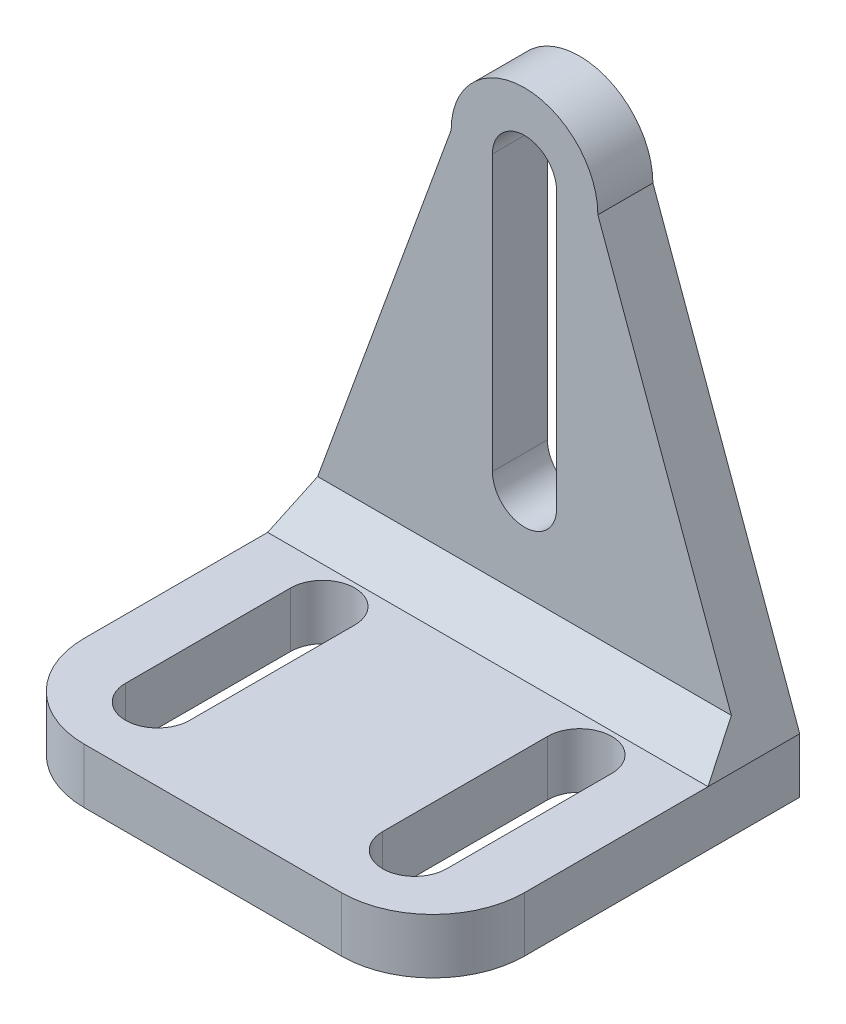
ISO-10303-21;
HEADER;
FILE_DESCRIPTION(('STEP AP214'),'2;1');
FILE_NAME('part.step','',(''),(''),'','','');
FILE_SCHEMA(('AUTOMOTIVE_DESIGN { 1 0 10303 214 1 1 1 1 }'));
ENDSEC;
DATA;
#1=APPLICATION_CONTEXT('core data for automotive mechanical design processes');
#2=APPLICATION_PROTOCOL_DEFINITION('international standard','automotive_design',2000,#1);
#3=PRODUCT_CONTEXT('',#1,'mechanical');
#4=PRODUCT('Part','Part','',(#3));
#5=PRODUCT_RELATED_PRODUCT_CATEGORY('part','',(#4));
#6=PRODUCT_DEFINITION_FORMATION('','',#4);
#7=PRODUCT_DEFINITION_CONTEXT('part definition',#1,'design');
#8=PRODUCT_DEFINITION('design','',#6,#7);
#9=PRODUCT_DEFINITION_SHAPE('','',#8);
#10=(LENGTH_UNIT() NAMED_UNIT(*) SI_UNIT(.MILLI.,.METRE.));
#11=(NAMED_UNIT(*) PLANE_ANGLE_UNIT() SI_UNIT($,.RADIAN.));
#12=(NAMED_UNIT(*) SI_UNIT($,.STERADIAN.) SOLID_ANGLE_UNIT());
#13=UNCERTAINTY_MEASURE_WITH_UNIT(LENGTH_MEASURE(1.E-05),#10,'distance_accuracy_value','');
#14=(GEOMETRIC_REPRESENTATION_CONTEXT(3) GLOBAL_UNCERTAINTY_ASSIGNED_CONTEXT((#13)) GLOBAL_UNIT_ASSIGNED_CONTEXT((#10,
#11,#12)) REPRESENTATION_CONTEXT('',''));
#15=CARTESIAN_POINT('',(0.,0.,0.));
#16=DIRECTION('',(0.,0.,1.));
#17=DIRECTION('',(1.,0.,0.));
#18=AXIS2_PLACEMENT_3D('',#15,#16,#17);
#19=CARTESIAN_POINT('',(1.75,0.,3.));
#20=DIRECTION('',(1.,0.,0.));
#21=DIRECTION('',(0.,1.,0.));
#22=AXIS2_PLACEMENT_3D('',#19,#20,#21);
#23=PLANE('',#22);
#24=DIRECTION('',(0.,-1.,0.));
#25=VECTOR('',#24,1.);
#26=CARTESIAN_POINT('',(1.75,0.,0.));
#27=LINE('',#26,#25);
#28=CARTESIAN_POINT('',(1.75,0.,0.));
#29=VERTEX_POINT('',#28);
#30=CARTESIAN_POINT('',(1.75,-15.,0.));
#31=VERTEX_POINT('',#30);
#32=EDGE_CURVE('E305',#29,#31,#27,.T.);
#33=ORIENTED_EDGE('',*,*,#32,.T.);
#34=DIRECTION('',(0.,0.,-1.));
#35=VECTOR('',#34,1.);
#36=CARTESIAN_POINT('',(1.75,-15.,3.));
#37=LINE('',#36,#35);
#38=CARTESIAN_POINT('',(1.75,-15.,3.));
#39=VERTEX_POINT('',#38);
#40=EDGE_CURVE('E323',#39,#31,#37,.T.);
#41=ORIENTED_EDGE('',*,*,#40,.F.);
#42=DIRECTION('',(0.,-1.,0.));
#43=VECTOR('',#42,1.);
#44=CARTESIAN_POINT('',(1.75,0.,3.));
#45=LINE('',#44,#43);
#46=CARTESIAN_POINT('',(1.75,0.,3.));
#47=VERTEX_POINT('',#46);
#48=EDGE_CURVE('E288',#47,#39,#45,.T.);
#49=ORIENTED_EDGE('',*,*,#48,.F.);
#50=DIRECTION('',(0.,0.,-1.));
#51=VECTOR('',#50,1.);
#52=CARTESIAN_POINT('',(1.75,0.,3.));
#53=LINE('',#52,#51);
#54=EDGE_CURVE('E316',#47,#29,#53,.T.);
#55=ORIENTED_EDGE('',*,*,#54,.T.);
#56=EDGE_LOOP('',(#33,#41,#49,#55));
#57=FACE_BOUND('',#56,.T.);
#58=ADVANCED_FACE('F43',(#57),#23,.F.);
#59=CARTESIAN_POINT('',(0.,-15.,3.));
#60=DIRECTION('',(0.,0.,-1.));
#61=DIRECTION('',(-1.,0.,0.));
#62=AXIS2_PLACEMENT_3D('',#59,#60,#61);
#63=CYLINDRICAL_SURFACE('',#62,1.75);
#64=CARTESIAN_POINT('',(0.,-15.,0.));
#65=DIRECTION('',(0.,0.,1.));
#66=DIRECTION('',(1.,0.,0.));
#67=AXIS2_PLACEMENT_3D('',#64,#65,#66);
#68=CIRCLE('',#67,1.75);
#69=CARTESIAN_POINT('',(-1.75,-15.,0.));
#70=VERTEX_POINT('',#69);
#71=EDGE_CURVE('E308',#70,#31,#68,.T.);
#72=ORIENTED_EDGE('',*,*,#71,.F.);
#73=DIRECTION('',(0.,0.,-1.));
#74=VECTOR('',#73,1.);
#75=CARTESIAN_POINT('',(-1.75,-15.,3.));
#76=LINE('',#75,#74);
#77=CARTESIAN_POINT('',(-1.75,-15.,3.));
#78=VERTEX_POINT('',#77);
#79=EDGE_CURVE('E321',#78,#70,#76,.T.);
#80=ORIENTED_EDGE('',*,*,#79,.F.);
#81=CARTESIAN_POINT('',(0.,-15.,3.));
#82=DIRECTION('',(0.,0.,1.));
#83=DIRECTION('',(1.,0.,0.));
#84=AXIS2_PLACEMENT_3D('',#81,#82,#83);
#85=CIRCLE('',#84,1.75);
#86=EDGE_CURVE('E290',#78,#39,#85,.T.);
#87=ORIENTED_EDGE('',*,*,#86,.T.);
#88=ORIENTED_EDGE('',*,*,#40,.T.);
#89=EDGE_LOOP('',(#72,#80,#87,#88));
#90=FACE_BOUND('',#89,.T.);
#91=ADVANCED_FACE('F429',(#90),#63,.F.);
#92=CARTESIAN_POINT('',(-1.75,0.,3.));
#93=DIRECTION('',(1.,0.,0.));
#94=DIRECTION('',(0.,1.,0.));
#95=AXIS2_PLACEMENT_3D('',#92,#93,#94);
#96=PLANE('',#95);
#97=DIRECTION('',(0.,-1.,0.));
#98=VECTOR('',#97,1.);
#99=CARTESIAN_POINT('',(-1.75,0.,0.));
#100=LINE('',#99,#98);
#101=CARTESIAN_POINT('',(-1.75,0.,0.));
#102=VERTEX_POINT('',#101);
#103=EDGE_CURVE('E311',#102,#70,#100,.T.);
#104=ORIENTED_EDGE('',*,*,#103,.F.);
#105=DIRECTION('',(0.,0.,-1.));
#106=VECTOR('',#105,1.);
#107=CARTESIAN_POINT('',(-1.75,0.,3.));
#108=LINE('',#107,#106);
#109=CARTESIAN_POINT('',(-1.75,0.,3.));
#110=VERTEX_POINT('',#109);
#111=EDGE_CURVE('E318',#110,#102,#108,.T.);
#112=ORIENTED_EDGE('',*,*,#111,.F.);
#113=DIRECTION('',(0.,-1.,0.));
#114=VECTOR('',#113,1.);
#115=CARTESIAN_POINT('',(-1.75,0.,3.));
#116=LINE('',#115,#114);
#117=EDGE_CURVE('E293',#110,#78,#116,.T.);
#118=ORIENTED_EDGE('',*,*,#117,.T.);
#119=ORIENTED_EDGE('',*,*,#79,.T.);
#120=EDGE_LOOP('',(#104,#112,#118,#119));
#121=FACE_BOUND('',#120,.T.);
#122=ADVANCED_FACE('F434',(#121),#96,.T.);
#123=CARTESIAN_POINT('',(3.53208888623797,1.28557521937306,3.));
#124=DIRECTION('',(-0.93969262078591,-0.342020143325663,0.));
#125=DIRECTION('',(0.342020143325663,-0.939692620785911,0.));
#126=AXIS2_PLACEMENT_3D('',#123,#124,#125);
#127=PLANE('',#126);
#128=DIRECTION('',(-0.342020143325663,0.939692620785911,0.));
#129=VECTOR('',#128,1.);
#130=CARTESIAN_POINT('',(3.53208888623797,1.28557521937306,0.));
#131=LINE('',#130,#129);
#132=CARTESIAN_POINT('',(12.0073451538563,-22.,0.));
#133=VERTEX_POINT('',#132);
#134=CARTESIAN_POINT('',(4.,0.,0.));
#135=VERTEX_POINT('',#134);
#136=EDGE_CURVE('E280',#133,#135,#131,.T.);
#137=ORIENTED_EDGE('',*,*,#136,.T.);
#138=DIRECTION('',(0.,0.,-1.));
#139=VECTOR('',#138,1.);
#140=CARTESIAN_POINT('',(4.,0.,3.));
#141=LINE('',#140,#139);
#142=CARTESIAN_POINT('',(4.,0.,3.));
#143=VERTEX_POINT('',#142);
#144=EDGE_CURVE('E319',#143,#135,#141,.T.);
#145=ORIENTED_EDGE('',*,*,#144,.F.);
#146=DIRECTION('',(-0.342020143325663,0.939692620785911,0.));
#147=VECTOR('',#146,1.);
#148=CARTESIAN_POINT('',(3.53208888623797,1.28557521937306,3.));
#149=LINE('',#148,#147);
#150=CARTESIAN_POINT('',(11.2794046853239,-20.,3.));
#151=VERTEX_POINT('',#150);
#152=EDGE_CURVE('E281',#151,#143,#149,.T.);
#153=ORIENTED_EDGE('',*,*,#152,.F.);
#154=DIRECTION('',(0.249243569363949,-0.684791078771734,0.68479107877174));
#155=VECTOR('',#154,1.);
#156=CARTESIAN_POINT('',(7.16510602735606,-8.69605734034066,-8.30394265965946));
#157=LINE('',#156,#155);
#158=CARTESIAN_POINT('',(12.0073451538563,-22.,5.00000000000001));
#159=VERTEX_POINT('',#158);
#160=EDGE_CURVE('E11',#151,#159,#157,.T.);
#161=ORIENTED_EDGE('',*,*,#160,.T.);
#162=DIRECTION('',(0.,0.,-1.));
#163=VECTOR('',#162,1.);
#164=CARTESIAN_POINT('',(12.0073451538563,-22.,3.));
#165=LINE('',#164,#163);
#166=EDGE_CURVE('E59',#159,#133,#165,.T.);
#167=ORIENTED_EDGE('',*,*,#166,.T.);
#168=EDGE_LOOP('',(#137,#145,#153,#161,#167));
#169=FACE_BOUND('',#168,.T.);
#170=ADVANCED_FACE('F382',(#169),#127,.F.);
#171=CARTESIAN_POINT('',(0.,0.,3.));
#172=DIRECTION('',(0.,0.,-1.));
#173=DIRECTION('',(-1.,0.,0.));
#174=AXIS2_PLACEMENT_3D('',#171,#172,#173);
#175=CYLINDRICAL_SURFACE('',#174,4.);
#176=CARTESIAN_POINT('',(0.,0.,0.));
#177=DIRECTION('',(0.,0.,1.));
#178=DIRECTION('',(1.,0.,0.));
#179=AXIS2_PLACEMENT_3D('',#176,#177,#178);
#180=CIRCLE('',#179,4.);
#181=CARTESIAN_POINT('',(-4.,0.,0.));
#182=VERTEX_POINT('',#181);
#183=EDGE_CURVE('E301',#135,#182,#180,.T.);
#184=ORIENTED_EDGE('',*,*,#183,.T.);
#185=DIRECTION('',(0.,0.,-1.));
#186=VECTOR('',#185,1.);
#187=CARTESIAN_POINT('',(-4.,0.,3.));
#188=LINE('',#187,#186);
#189=CARTESIAN_POINT('',(-4.,0.,3.));
#190=VERTEX_POINT('',#189);
#191=EDGE_CURVE('E328',#190,#182,#188,.T.);
#192=ORIENTED_EDGE('',*,*,#191,.F.);
#193=CARTESIAN_POINT('',(0.,0.,3.));
#194=DIRECTION('',(0.,0.,1.));
#195=DIRECTION('',(1.,0.,0.));
#196=AXIS2_PLACEMENT_3D('',#193,#194,#195);
#197=CIRCLE('',#196,4.);
#198=EDGE_CURVE('E283',#143,#190,#197,.T.);
#199=ORIENTED_EDGE('',*,*,#198,.F.);
#200=ORIENTED_EDGE('',*,*,#144,.T.);
#201=EDGE_LOOP('',(#184,#192,#199,#200));
#202=FACE_BOUND('',#201,.T.);
#203=ADVANCED_FACE('F413',(#202),#175,.T.);
#204=CARTESIAN_POINT('',(-3.53208888623797,1.28557521937306,3.));
#205=DIRECTION('',(0.93969262078591,-0.342020143325663,0.));
#206=DIRECTION('',(0.342020143325663,0.939692620785911,0.));
#207=AXIS2_PLACEMENT_3D('',#204,#205,#206);
#208=PLANE('',#207);
#209=DIRECTION('',(-0.342020143325663,-0.939692620785911,0.));
#210=VECTOR('',#209,1.);
#211=CARTESIAN_POINT('',(-3.53208888623797,1.28557521937306,0.));
#212=LINE('',#211,#210);
#213=CARTESIAN_POINT('',(-12.0073451538563,-22.,0.));
#214=VERTEX_POINT('',#213);
#215=EDGE_CURVE('E303',#182,#214,#212,.T.);
#216=ORIENTED_EDGE('',*,*,#215,.T.);
#217=DIRECTION('',(0.,0.,-1.));
#218=VECTOR('',#217,1.);
#219=CARTESIAN_POINT('',(-12.0073451538563,-22.,3.));
#220=LINE('',#219,#218);
#221=CARTESIAN_POINT('',(-12.0073451538563,-22.,5.00000000000001));
#222=VERTEX_POINT('',#221);
#223=EDGE_CURVE('E76',#222,#214,#220,.T.);
#224=ORIENTED_EDGE('',*,*,#223,.F.);
#225=DIRECTION('',(0.249243569363948,0.684791078771734,-0.68479107877174));
#226=VECTOR('',#225,1.);
#227=CARTESIAN_POINT('',(-7.16510602735606,-8.69605734034067,-8.30394265965946));
#228=LINE('',#227,#226);
#229=CARTESIAN_POINT('',(-11.2794046853239,-20.,3.));
#230=VERTEX_POINT('',#229);
#231=EDGE_CURVE('E52',#222,#230,#228,.T.);
#232=ORIENTED_EDGE('',*,*,#231,.T.);
#233=DIRECTION('',(-0.342020143325663,-0.939692620785911,0.));
#234=VECTOR('',#233,1.);
#235=CARTESIAN_POINT('',(-3.53208888623797,1.28557521937306,3.));
#236=LINE('',#235,#234);
#237=EDGE_CURVE('E286',#190,#230,#236,.T.);
#238=ORIENTED_EDGE('',*,*,#237,.F.);
#239=ORIENTED_EDGE('',*,*,#191,.T.);
#240=EDGE_LOOP('',(#216,#224,#232,#238,#239));
#241=FACE_BOUND('',#240,.T.);
#242=ADVANCED_FACE('F414',(#241),#208,.F.);
#243=CARTESIAN_POINT('',(0.,0.,3.));
#244=DIRECTION('',(0.,0.,-1.));
#245=DIRECTION('',(-1.,0.,0.));
#246=AXIS2_PLACEMENT_3D('',#243,#244,#245);
#247=CYLINDRICAL_SURFACE('',#246,1.75);
#248=CARTESIAN_POINT('',(0.,0.,0.));
#249=DIRECTION('',(0.,0.,1.));
#250=DIRECTION('',(1.,0.,0.));
#251=AXIS2_PLACEMENT_3D('',#248,#249,#250);
#252=CIRCLE('',#251,1.75);
#253=EDGE_CURVE('E284',#29,#102,#252,.T.);
#254=ORIENTED_EDGE('',*,*,#253,.F.);
#255=ORIENTED_EDGE('',*,*,#54,.F.);
#256=CARTESIAN_POINT('',(0.,0.,3.));
#257=DIRECTION('',(0.,0.,1.));
#258=DIRECTION('',(1.,0.,0.));
#259=AXIS2_PLACEMENT_3D('',#256,#257,#258);
#260=CIRCLE('',#259,1.75);
#261=EDGE_CURVE('E296',#47,#110,#260,.T.);
#262=ORIENTED_EDGE('',*,*,#261,.T.);
#263=ORIENTED_EDGE('',*,*,#111,.T.);
#264=EDGE_LOOP('',(#254,#255,#262,#263));
#265=FACE_BOUND('',#264,.T.);
#266=ADVANCED_FACE('F416',(#265),#247,.F.);
#267=CARTESIAN_POINT('',(0.,0.,3.));
#268=DIRECTION('',(0.,0.,1.));
#269=DIRECTION('',(1.,0.,0.));
#270=AXIS2_PLACEMENT_3D('',#267,#268,#269);
#271=PLANE('',#270);
#272=ORIENTED_EDGE('',*,*,#237,.T.);
#273=DIRECTION('',(1.,0.,0.));
#274=VECTOR('',#273,1.);
#275=CARTESIAN_POINT('',(0.,-20.,3.));
#276=LINE('',#275,#274);
#277=EDGE_CURVE('E371',#230,#151,#276,.T.);
#278=ORIENTED_EDGE('',*,*,#277,.T.);
#279=ORIENTED_EDGE('',*,*,#152,.T.);
#280=ORIENTED_EDGE('',*,*,#198,.T.);
#281=EDGE_LOOP('',(#272,#278,#279,#280));
#282=FACE_BOUND('',#281,.T.);
#283=ORIENTED_EDGE('',*,*,#48,.T.);
#284=ORIENTED_EDGE('',*,*,#86,.F.);
#285=ORIENTED_EDGE('',*,*,#117,.F.);
#286=ORIENTED_EDGE('',*,*,#261,.F.);
#287=EDGE_LOOP('',(#283,#284,#285,#286));
#288=FACE_BOUND('',#287,.T.);
#289=ADVANCED_FACE('F375',(#282,#288),#271,.T.);
#290=CARTESIAN_POINT('',(0.,0.,0.));
#291=DIRECTION('',(0.,0.,1.));
#292=DIRECTION('',(1.,0.,0.));
#293=AXIS2_PLACEMENT_3D('',#290,#291,#292);
#294=PLANE('',#293);
#295=ORIENTED_EDGE('',*,*,#136,.F.);
#296=DIRECTION('',(0.,-1.,0.));
#297=VECTOR('',#296,1.);
#298=CARTESIAN_POINT('',(12.0073451538563,0.,0.));
#299=LINE('',#298,#297);
#300=CARTESIAN_POINT('',(12.0073451538563,-25.,0.));
#301=VERTEX_POINT('',#300);
#302=EDGE_CURVE('E267',#133,#301,#299,.T.);
#303=ORIENTED_EDGE('',*,*,#302,.T.);
#304=DIRECTION('',(1.,0.,0.));
#305=VECTOR('',#304,1.);
#306=CARTESIAN_POINT('',(0.,-25.,0.));
#307=LINE('',#306,#305);
#308=CARTESIAN_POINT('',(-12.0073451538563,-25.,0.));
#309=VERTEX_POINT('',#308);
#310=EDGE_CURVE('E234',#309,#301,#307,.T.);
#311=ORIENTED_EDGE('',*,*,#310,.F.);
#312=DIRECTION('',(0.,1.,0.));
#313=VECTOR('',#312,1.);
#314=CARTESIAN_POINT('',(-12.0073451538563,0.,0.));
#315=LINE('',#314,#313);
#316=EDGE_CURVE('E261',#309,#214,#315,.T.);
#317=ORIENTED_EDGE('',*,*,#316,.T.);
#318=ORIENTED_EDGE('',*,*,#215,.F.);
#319=ORIENTED_EDGE('',*,*,#183,.F.);
#320=EDGE_LOOP('',(#295,#303,#311,#317,#318,#319));
#321=FACE_BOUND('',#320,.T.);
#322=ORIENTED_EDGE('',*,*,#32,.F.);
#323=ORIENTED_EDGE('',*,*,#253,.T.);
#324=ORIENTED_EDGE('',*,*,#103,.T.);
#325=ORIENTED_EDGE('',*,*,#71,.T.);
#326=EDGE_LOOP('',(#322,#323,#324,#325));
#327=FACE_BOUND('',#326,.T.);
#328=ADVANCED_FACE('F408',(#321,#327),#294,.F.);
#329=CARTESIAN_POINT('',(0.,-22.,20.));
#330=DIRECTION('',(0.,-1.,0.));
#331=DIRECTION('',(1.,0.,0.));
#332=AXIS2_PLACEMENT_3D('',#329,#330,#331);
#333=PLANE('',#332);
#334=DIRECTION('',(0.,0.,1.));
#335=VECTOR('',#334,1.);
#336=CARTESIAN_POINT('',(-8.7573451538563,-22.,0.));
#337=LINE('',#336,#335);
#338=CARTESIAN_POINT('',(-8.7573451538563,-22.,7.));
#339=VERTEX_POINT('',#338);
#340=CARTESIAN_POINT('',(-8.7573451538563,-22.,16.));
#341=VERTEX_POINT('',#340);
#342=EDGE_CURVE('E217',#339,#341,#337,.T.);
#343=ORIENTED_EDGE('',*,*,#342,.F.);
#344=CARTESIAN_POINT('',(-7.0073451538563,-22.,7.));
#345=DIRECTION('',(0.,1.,0.));
#346=DIRECTION('',(-1.,0.,0.));
#347=AXIS2_PLACEMENT_3D('',#344,#345,#346);
#348=CIRCLE('',#347,1.75);
#349=CARTESIAN_POINT('',(-5.2573451538563,-22.,7.));
#350=VERTEX_POINT('',#349);
#351=EDGE_CURVE('E222',#350,#339,#348,.T.);
#352=ORIENTED_EDGE('',*,*,#351,.F.);
#353=DIRECTION('',(0.,0.,1.));
#354=VECTOR('',#353,1.);
#355=CARTESIAN_POINT('',(-5.2573451538563,-22.,0.));
#356=LINE('',#355,#354);
#357=CARTESIAN_POINT('',(-5.25734515385629,-22.,16.));
#358=VERTEX_POINT('',#357);
#359=EDGE_CURVE('E227',#350,#358,#356,.T.);
#360=ORIENTED_EDGE('',*,*,#359,.T.);
#361=CARTESIAN_POINT('',(-7.00734515385629,-22.,16.));
#362=DIRECTION('',(0.,1.,0.));
#363=DIRECTION('',(-1.,0.,0.));
#364=AXIS2_PLACEMENT_3D('',#361,#362,#363);
#365=CIRCLE('',#364,1.75);
#366=EDGE_CURVE('E206',#341,#358,#365,.T.);
#367=ORIENTED_EDGE('',*,*,#366,.F.);
#368=EDGE_LOOP('',(#343,#352,#360,#367));
#369=FACE_BOUND('',#368,.T.);
#370=DIRECTION('',(0.,0.,-1.));
#371=VECTOR('',#370,1.);
#372=CARTESIAN_POINT('',(8.75734515385631,-22.,0.));
#373=LINE('',#372,#371);
#374=CARTESIAN_POINT('',(8.7573451538563,-22.,16.));
#375=VERTEX_POINT('',#374);
#376=CARTESIAN_POINT('',(8.7573451538563,-22.,7.));
#377=VERTEX_POINT('',#376);
#378=EDGE_CURVE('E239',#375,#377,#373,.T.);
#379=ORIENTED_EDGE('',*,*,#378,.F.);
#380=CARTESIAN_POINT('',(7.0073451538563,-22.,16.));
#381=DIRECTION('',(0.,1.,0.));
#382=DIRECTION('',(-1.,0.,0.));
#383=AXIS2_PLACEMENT_3D('',#380,#381,#382);
#384=CIRCLE('',#383,1.75);
#385=CARTESIAN_POINT('',(5.2573451538563,-22.,16.));
#386=VERTEX_POINT('',#385);
#387=EDGE_CURVE('E237',#386,#375,#384,.T.);
#388=ORIENTED_EDGE('',*,*,#387,.F.);
#389=DIRECTION('',(0.,0.,1.));
#390=VECTOR('',#389,1.);
#391=CARTESIAN_POINT('',(5.2573451538563,-22.,0.));
#392=LINE('',#391,#390);
#393=CARTESIAN_POINT('',(5.2573451538563,-22.,7.));
#394=VERTEX_POINT('',#393);
#395=EDGE_CURVE('E245',#394,#386,#392,.T.);
#396=ORIENTED_EDGE('',*,*,#395,.F.);
#397=CARTESIAN_POINT('',(7.0073451538563,-22.,7.));
#398=DIRECTION('',(0.,1.,0.));
#399=DIRECTION('',(-1.,0.,0.));
#400=AXIS2_PLACEMENT_3D('',#397,#398,#399);
#401=CIRCLE('',#400,1.75);
#402=EDGE_CURVE('E242',#377,#394,#401,.T.);
#403=ORIENTED_EDGE('',*,*,#402,.F.);
#404=EDGE_LOOP('',(#379,#388,#396,#403));
#405=FACE_BOUND('',#404,.T.);
#406=DIRECTION('',(0.,0.,-1.));
#407=VECTOR('',#406,1.);
#408=CARTESIAN_POINT('',(12.0073451538563,-22.,20.));
#409=LINE('',#408,#407);
#410=CARTESIAN_POINT('',(12.0073451538563,-22.,15.));
#411=VERTEX_POINT('',#410);
#412=EDGE_CURVE('E276',#411,#159,#409,.T.);
#413=ORIENTED_EDGE('',*,*,#412,.T.);
#414=DIRECTION('',(-1.,0.,0.));
#415=VECTOR('',#414,1.);
#416=CARTESIAN_POINT('',(0.,-22.,5.00000000000001));
#417=LINE('',#416,#415);
#418=EDGE_CURVE('E368',#159,#222,#417,.T.);
#419=ORIENTED_EDGE('',*,*,#418,.T.);
#420=DIRECTION('',(0.,0.,-1.));
#421=VECTOR('',#420,1.);
#422=CARTESIAN_POINT('',(-12.0073451538563,-22.,20.));
#423=LINE('',#422,#421);
#424=CARTESIAN_POINT('',(-12.0073451538563,-22.,15.));
#425=VERTEX_POINT('',#424);
#426=EDGE_CURVE('E273',#425,#222,#423,.T.);
#427=ORIENTED_EDGE('',*,*,#426,.F.);
#428=CARTESIAN_POINT('',(-7.0073451538563,-22.,15.));
#429=DIRECTION('',(0.,-1.,0.));
#430=DIRECTION('',(1.,0.,0.));
#431=AXIS2_PLACEMENT_3D('',#428,#429,#430);
#432=CIRCLE('',#431,5.);
#433=CARTESIAN_POINT('',(-7.0073451538563,-22.,20.));
#434=VERTEX_POINT('',#433);
#435=EDGE_CURVE('E357',#425,#434,#432,.F.);
#436=ORIENTED_EDGE('',*,*,#435,.T.);
#437=DIRECTION('',(-1.,0.,0.));
#438=VECTOR('',#437,1.);
#439=CARTESIAN_POINT('',(0.,-22.,20.));
#440=LINE('',#439,#438);
#441=CARTESIAN_POINT('',(7.0073451538563,-22.,20.));
#442=VERTEX_POINT('',#441);
#443=EDGE_CURVE('E260',#442,#434,#440,.T.);
#444=ORIENTED_EDGE('',*,*,#443,.F.);
#445=CARTESIAN_POINT('',(7.0073451538563,-22.,15.));
#446=DIRECTION('',(0.,-1.,0.));
#447=DIRECTION('',(1.,0.,0.));
#448=AXIS2_PLACEMENT_3D('',#445,#446,#447);
#449=CIRCLE('',#448,5.);
#450=EDGE_CURVE('E355',#442,#411,#449,.F.);
#451=ORIENTED_EDGE('',*,*,#450,.T.);
#452=EDGE_LOOP('',(#413,#419,#427,#436,#444,#451));
#453=FACE_BOUND('',#452,.T.);
#454=ADVANCED_FACE('F224',(#369,#405,#453),#333,.F.);
#455=CARTESIAN_POINT('',(0.,-25.,20.));
#456=DIRECTION('',(0.,1.,0.));
#457=DIRECTION('',(-1.,0.,0.));
#458=AXIS2_PLACEMENT_3D('',#455,#456,#457);
#459=PLANE('',#458);
#460=DIRECTION('',(0.,0.,1.));
#461=VECTOR('',#460,1.);
#462=CARTESIAN_POINT('',(-5.25734515385629,-25.,20.));
#463=LINE('',#462,#461);
#464=CARTESIAN_POINT('',(-5.2573451538563,-25.,7.));
#465=VERTEX_POINT('',#464);
#466=CARTESIAN_POINT('',(-5.25734515385629,-25.,16.));
#467=VERTEX_POINT('',#466);
#468=EDGE_CURVE('E347',#465,#467,#463,.T.);
#469=ORIENTED_EDGE('',*,*,#468,.F.);
#470=CARTESIAN_POINT('',(-7.0073451538563,-25.,7.));
#471=DIRECTION('',(0.,1.,0.));
#472=DIRECTION('',(-1.,0.,0.));
#473=AXIS2_PLACEMENT_3D('',#470,#471,#472);
#474=CIRCLE('',#473,1.75);
#475=CARTESIAN_POINT('',(-8.7573451538563,-25.,7.));
#476=VERTEX_POINT('',#475);
#477=EDGE_CURVE('E349',#465,#476,#474,.T.);
#478=ORIENTED_EDGE('',*,*,#477,.T.);
#479=DIRECTION('',(0.,0.,1.));
#480=VECTOR('',#479,1.);
#481=CARTESIAN_POINT('',(-8.7573451538563,-25.,20.));
#482=LINE('',#481,#480);
#483=CARTESIAN_POINT('',(-8.7573451538563,-25.,16.));
#484=VERTEX_POINT('',#483);
#485=EDGE_CURVE('E344',#476,#484,#482,.T.);
#486=ORIENTED_EDGE('',*,*,#485,.T.);
#487=CARTESIAN_POINT('',(-7.00734515385629,-25.,16.));
#488=DIRECTION('',(0.,1.,0.));
#489=DIRECTION('',(-1.,0.,0.));
#490=AXIS2_PLACEMENT_3D('',#487,#488,#489);
#491=CIRCLE('',#490,1.75);
#492=EDGE_CURVE('E209',#484,#467,#491,.T.);
#493=ORIENTED_EDGE('',*,*,#492,.T.);
#494=EDGE_LOOP('',(#469,#478,#486,#493));
#495=FACE_BOUND('',#494,.T.);
#496=DIRECTION('',(0.,0.,1.));
#497=VECTOR('',#496,1.);
#498=CARTESIAN_POINT('',(5.2573451538563,-25.,20.));
#499=LINE('',#498,#497);
#500=CARTESIAN_POINT('',(5.2573451538563,-25.,7.));
#501=VERTEX_POINT('',#500);
#502=CARTESIAN_POINT('',(5.2573451538563,-25.,16.));
#503=VERTEX_POINT('',#502);
#504=EDGE_CURVE('E338',#501,#503,#499,.T.);
#505=ORIENTED_EDGE('',*,*,#504,.T.);
#506=CARTESIAN_POINT('',(7.0073451538563,-25.,16.));
#507=DIRECTION('',(0.,1.,0.));
#508=DIRECTION('',(-1.,0.,0.));
#509=AXIS2_PLACEMENT_3D('',#506,#507,#508);
#510=CIRCLE('',#509,1.75);
#511=CARTESIAN_POINT('',(8.7573451538563,-25.,16.));
#512=VERTEX_POINT('',#511);
#513=EDGE_CURVE('E341',#503,#512,#510,.T.);
#514=ORIENTED_EDGE('',*,*,#513,.T.);
#515=DIRECTION('',(0.,0.,-1.));
#516=VECTOR('',#515,1.);
#517=CARTESIAN_POINT('',(8.7573451538563,-25.,20.));
#518=LINE('',#517,#516);
#519=CARTESIAN_POINT('',(8.7573451538563,-25.,7.));
#520=VERTEX_POINT('',#519);
#521=EDGE_CURVE('E325',#512,#520,#518,.T.);
#522=ORIENTED_EDGE('',*,*,#521,.T.);
#523=CARTESIAN_POINT('',(7.0073451538563,-25.,7.));
#524=DIRECTION('',(0.,1.,0.));
#525=DIRECTION('',(-1.,0.,0.));
#526=AXIS2_PLACEMENT_3D('',#523,#524,#525);
#527=CIRCLE('',#526,1.75);
#528=EDGE_CURVE('E335',#520,#501,#527,.T.);
#529=ORIENTED_EDGE('',*,*,#528,.T.);
#530=EDGE_LOOP('',(#505,#514,#522,#529));
#531=FACE_BOUND('',#530,.T.);
#532=DIRECTION('',(1.,0.,0.));
#533=VECTOR('',#532,1.);
#534=CARTESIAN_POINT('',(0.,-25.,20.));
#535=LINE('',#534,#533);
#536=CARTESIAN_POINT('',(-7.0073451538563,-25.,20.));
#537=VERTEX_POINT('',#536);
#538=CARTESIAN_POINT('',(7.0073451538563,-25.,20.));
#539=VERTEX_POINT('',#538);
#540=EDGE_CURVE('E257',#537,#539,#535,.T.);
#541=ORIENTED_EDGE('',*,*,#540,.F.);
#542=CARTESIAN_POINT('',(-7.0073451538563,-25.,15.));
#543=DIRECTION('',(0.,1.,0.));
#544=DIRECTION('',(-1.,0.,0.));
#545=AXIS2_PLACEMENT_3D('',#542,#543,#544);
#546=CIRCLE('',#545,5.);
#547=CARTESIAN_POINT('',(-12.0073451538563,-25.,15.));
#548=VERTEX_POINT('',#547);
#549=EDGE_CURVE('E364',#537,#548,#546,.F.);
#550=ORIENTED_EDGE('',*,*,#549,.T.);
#551=DIRECTION('',(0.,0.,-1.));
#552=VECTOR('',#551,1.);
#553=CARTESIAN_POINT('',(-12.0073451538563,-25.,20.));
#554=LINE('',#553,#552);
#555=EDGE_CURVE('E264',#548,#309,#554,.T.);
#556=ORIENTED_EDGE('',*,*,#555,.T.);
#557=ORIENTED_EDGE('',*,*,#310,.T.);
#558=DIRECTION('',(0.,0.,-1.));
#559=VECTOR('',#558,1.);
#560=CARTESIAN_POINT('',(12.0073451538563,-25.,20.));
#561=LINE('',#560,#559);
#562=CARTESIAN_POINT('',(12.0073451538563,-25.,15.));
#563=VERTEX_POINT('',#562);
#564=EDGE_CURVE('E278',#563,#301,#561,.T.);
#565=ORIENTED_EDGE('',*,*,#564,.F.);
#566=CARTESIAN_POINT('',(7.0073451538563,-25.,15.));
#567=DIRECTION('',(0.,1.,0.));
#568=DIRECTION('',(-1.,0.,0.));
#569=AXIS2_PLACEMENT_3D('',#566,#567,#568);
#570=CIRCLE('',#569,5.);
#571=EDGE_CURVE('E83',#563,#539,#570,.F.);
#572=ORIENTED_EDGE('',*,*,#571,.T.);
#573=EDGE_LOOP('',(#541,#550,#556,#557,#565,#572));
#574=FACE_BOUND('',#573,.T.);
#575=ADVANCED_FACE('F404',(#495,#531,#574),#459,.F.);
#576=CARTESIAN_POINT('',(12.0073451538563,0.,20.));
#577=DIRECTION('',(1.,0.,0.));
#578=DIRECTION('',(0.,0.,-1.));
#579=AXIS2_PLACEMENT_3D('',#576,#577,#578);
#580=PLANE('',#579);
#581=ORIENTED_EDGE('',*,*,#412,.F.);
#582=DIRECTION('',(0.,-1.,0.));
#583=VECTOR('',#582,1.);
#584=CARTESIAN_POINT('',(12.0073451538563,0.,15.));
#585=LINE('',#584,#583);
#586=EDGE_CURVE('E366',#411,#563,#585,.T.);
#587=ORIENTED_EDGE('',*,*,#586,.T.);
#588=ORIENTED_EDGE('',*,*,#564,.T.);
#589=ORIENTED_EDGE('',*,*,#302,.F.);
#590=ORIENTED_EDGE('',*,*,#166,.F.);
#591=EDGE_LOOP('',(#581,#587,#588,#589,#590));
#592=FACE_BOUND('',#591,.T.);
#593=ADVANCED_FACE('F401',(#592),#580,.T.);
#594=CARTESIAN_POINT('',(-12.0073451538563,0.,20.));
#595=DIRECTION('',(-1.,0.,0.));
#596=DIRECTION('',(0.,0.,1.));
#597=AXIS2_PLACEMENT_3D('',#594,#595,#596);
#598=PLANE('',#597);
#599=ORIENTED_EDGE('',*,*,#555,.F.);
#600=DIRECTION('',(0.,1.,0.));
#601=VECTOR('',#600,1.);
#602=CARTESIAN_POINT('',(-12.0073451538563,0.,15.));
#603=LINE('',#602,#601);
#604=EDGE_CURVE('E352',#548,#425,#603,.T.);
#605=ORIENTED_EDGE('',*,*,#604,.T.);
#606=ORIENTED_EDGE('',*,*,#426,.T.);
#607=ORIENTED_EDGE('',*,*,#223,.T.);
#608=ORIENTED_EDGE('',*,*,#316,.F.);
#609=EDGE_LOOP('',(#599,#605,#606,#607,#608));
#610=FACE_BOUND('',#609,.T.);
#611=ADVANCED_FACE('F388',(#610),#598,.T.);
#612=CARTESIAN_POINT('',(0.,0.,20.));
#613=DIRECTION('',(0.,0.,1.));
#614=DIRECTION('',(1.,0.,0.));
#615=AXIS2_PLACEMENT_3D('',#612,#613,#614);
#616=PLANE('',#615);
#617=ORIENTED_EDGE('',*,*,#443,.T.);
#618=DIRECTION('',(0.,1.,0.));
#619=VECTOR('',#618,1.);
#620=CARTESIAN_POINT('',(-7.0073451538563,0.,20.));
#621=LINE('',#620,#619);
#622=EDGE_CURVE('E361',#434,#537,#621,.F.);
#623=ORIENTED_EDGE('',*,*,#622,.T.);
#624=ORIENTED_EDGE('',*,*,#540,.T.);
#625=DIRECTION('',(0.,-1.,0.));
#626=VECTOR('',#625,1.);
#627=CARTESIAN_POINT('',(7.0073451538563,0.,20.));
#628=LINE('',#627,#626);
#629=EDGE_CURVE('E359',#539,#442,#628,.F.);
#630=ORIENTED_EDGE('',*,*,#629,.T.);
#631=EDGE_LOOP('',(#617,#623,#624,#630));
#632=FACE_BOUND('',#631,.T.);
#633=ADVANCED_FACE('F398',(#632),#616,.T.);
#634=CARTESIAN_POINT('',(7.0073451538563,-37.,16.));
#635=DIRECTION('',(0.,1.,0.));
#636=DIRECTION('',(-1.,0.,0.));
#637=AXIS2_PLACEMENT_3D('',#634,#635,#636);
#638=CYLINDRICAL_SURFACE('',#637,1.75);
#639=DIRECTION('',(0.,1.,0.));
#640=VECTOR('',#639,1.);
#641=CARTESIAN_POINT('',(5.2573451538563,-37.,16.));
#642=LINE('',#641,#640);
#643=EDGE_CURVE('E249',#503,#386,#642,.T.);
#644=ORIENTED_EDGE('',*,*,#643,.T.);
#645=ORIENTED_EDGE('',*,*,#387,.T.);
#646=DIRECTION('',(0.,1.,0.));
#647=VECTOR('',#646,1.);
#648=CARTESIAN_POINT('',(8.7573451538563,-37.,16.));
#649=LINE('',#648,#647);
#650=EDGE_CURVE('E248',#512,#375,#649,.T.);
#651=ORIENTED_EDGE('',*,*,#650,.F.);
#652=ORIENTED_EDGE('',*,*,#513,.F.);
#653=EDGE_LOOP('',(#644,#645,#651,#652));
#654=FACE_BOUND('',#653,.T.);
#655=ADVANCED_FACE('F455',(#654),#638,.F.);
#656=CARTESIAN_POINT('',(5.25734515385631,-37.,0.));
#657=DIRECTION('',(-1.,0.,0.));
#658=DIRECTION('',(0.,-1.,0.));
#659=AXIS2_PLACEMENT_3D('',#656,#657,#658);
#660=PLANE('',#659);
#661=DIRECTION('',(0.,1.,0.));
#662=VECTOR('',#661,1.);
#663=CARTESIAN_POINT('',(5.2573451538563,-37.,7.));
#664=LINE('',#663,#662);
#665=EDGE_CURVE('E251',#501,#394,#664,.T.);
#666=ORIENTED_EDGE('',*,*,#665,.T.);
#667=ORIENTED_EDGE('',*,*,#395,.T.);
#668=ORIENTED_EDGE('',*,*,#643,.F.);
#669=ORIENTED_EDGE('',*,*,#504,.F.);
#670=EDGE_LOOP('',(#666,#667,#668,#669));
#671=FACE_BOUND('',#670,.T.);
#672=ADVANCED_FACE('F458',(#671),#660,.F.);
#673=CARTESIAN_POINT('',(7.00734515385631,-37.,7.));
#674=DIRECTION('',(0.,1.,0.));
#675=DIRECTION('',(-1.,0.,0.));
#676=AXIS2_PLACEMENT_3D('',#673,#674,#675);
#677=CYLINDRICAL_SURFACE('',#676,1.75);
#678=DIRECTION('',(0.,1.,0.));
#679=VECTOR('',#678,1.);
#680=CARTESIAN_POINT('',(8.75734515385631,-37.,7.));
#681=LINE('',#680,#679);
#682=EDGE_CURVE('E253',#520,#377,#681,.T.);
#683=ORIENTED_EDGE('',*,*,#682,.T.);
#684=ORIENTED_EDGE('',*,*,#402,.T.);
#685=ORIENTED_EDGE('',*,*,#665,.F.);
#686=ORIENTED_EDGE('',*,*,#528,.F.);
#687=EDGE_LOOP('',(#683,#684,#685,#686));
#688=FACE_BOUND('',#687,.T.);
#689=ADVANCED_FACE('F464',(#688),#677,.F.);
#690=CARTESIAN_POINT('',(8.75734515385631,-37.,0.));
#691=DIRECTION('',(1.,0.,0.));
#692=DIRECTION('',(0.,0.,-1.));
#693=AXIS2_PLACEMENT_3D('',#690,#691,#692);
#694=PLANE('',#693);
#695=ORIENTED_EDGE('',*,*,#650,.T.);
#696=ORIENTED_EDGE('',*,*,#378,.T.);
#697=ORIENTED_EDGE('',*,*,#682,.F.);
#698=ORIENTED_EDGE('',*,*,#521,.F.);
#699=EDGE_LOOP('',(#695,#696,#697,#698));
#700=FACE_BOUND('',#699,.T.);
#701=ADVANCED_FACE('F460',(#700),#694,.F.);
#702=CARTESIAN_POINT('',(-7.00734515385629,-37.,7.));
#703=DIRECTION('',(0.,1.,0.));
#704=DIRECTION('',(-1.,0.,0.));
#705=AXIS2_PLACEMENT_3D('',#702,#703,#704);
#706=CYLINDRICAL_SURFACE('',#705,1.75);
#707=DIRECTION('',(0.,1.,0.));
#708=VECTOR('',#707,1.);
#709=CARTESIAN_POINT('',(-5.25734515385629,-37.,7.));
#710=LINE('',#709,#708);
#711=EDGE_CURVE('E232',#465,#350,#710,.T.);
#712=ORIENTED_EDGE('',*,*,#711,.T.);
#713=ORIENTED_EDGE('',*,*,#351,.T.);
#714=DIRECTION('',(0.,1.,0.));
#715=VECTOR('',#714,1.);
#716=CARTESIAN_POINT('',(-8.75734515385629,-37.,7.));
#717=LINE('',#716,#715);
#718=EDGE_CURVE('E213',#476,#339,#717,.T.);
#719=ORIENTED_EDGE('',*,*,#718,.F.);
#720=ORIENTED_EDGE('',*,*,#477,.F.);
#721=EDGE_LOOP('',(#712,#713,#719,#720));
#722=FACE_BOUND('',#721,.T.);
#723=ADVANCED_FACE('F463',(#722),#706,.F.);
#724=CARTESIAN_POINT('',(-5.25734515385629,-37.,0.));
#725=DIRECTION('',(-1.,0.,0.));
#726=DIRECTION('',(0.,-1.,0.));
#727=AXIS2_PLACEMENT_3D('',#724,#725,#726);
#728=PLANE('',#727);
#729=ORIENTED_EDGE('',*,*,#468,.T.);
#730=DIRECTION('',(0.,1.,0.));
#731=VECTOR('',#730,1.);
#732=CARTESIAN_POINT('',(-5.25734515385629,-37.,16.));
#733=LINE('',#732,#731);
#734=EDGE_CURVE('E212',#467,#358,#733,.T.);
#735=ORIENTED_EDGE('',*,*,#734,.T.);
#736=ORIENTED_EDGE('',*,*,#359,.F.);
#737=ORIENTED_EDGE('',*,*,#711,.F.);
#738=EDGE_LOOP('',(#729,#735,#736,#737));
#739=FACE_BOUND('',#738,.T.);
#740=ADVANCED_FACE('F474',(#739),#728,.T.);
#741=CARTESIAN_POINT('',(-7.00734515385629,-37.,16.));
#742=DIRECTION('',(0.,1.,0.));
#743=DIRECTION('',(-1.,0.,0.));
#744=AXIS2_PLACEMENT_3D('',#741,#742,#743);
#745=CYLINDRICAL_SURFACE('',#744,1.75);
#746=DIRECTION('',(0.,1.,0.));
#747=VECTOR('',#746,1.);
#748=CARTESIAN_POINT('',(-8.75734515385629,-37.,16.));
#749=LINE('',#748,#747);
#750=EDGE_CURVE('E201',#484,#341,#749,.T.);
#751=ORIENTED_EDGE('',*,*,#750,.T.);
#752=ORIENTED_EDGE('',*,*,#366,.T.);
#753=ORIENTED_EDGE('',*,*,#734,.F.);
#754=ORIENTED_EDGE('',*,*,#492,.F.);
#755=EDGE_LOOP('',(#751,#752,#753,#754));
#756=FACE_BOUND('',#755,.T.);
#757=ADVANCED_FACE('F203',(#756),#745,.F.);
#758=CARTESIAN_POINT('',(-8.75734515385629,-37.,0.));
#759=DIRECTION('',(-1.,0.,0.));
#760=DIRECTION('',(0.,-1.,0.));
#761=AXIS2_PLACEMENT_3D('',#758,#759,#760);
#762=PLANE('',#761);
#763=ORIENTED_EDGE('',*,*,#718,.T.);
#764=ORIENTED_EDGE('',*,*,#342,.T.);
#765=ORIENTED_EDGE('',*,*,#750,.F.);
#766=ORIENTED_EDGE('',*,*,#485,.F.);
#767=EDGE_LOOP('',(#763,#764,#765,#766));
#768=FACE_BOUND('',#767,.T.);
#769=ADVANCED_FACE('F218',(#768),#762,.F.);
#770=CARTESIAN_POINT('',(-7.0073451538563,0.,15.));
#771=DIRECTION('',(0.,1.,0.));
#772=DIRECTION('',(0.,0.,1.));
#773=AXIS2_PLACEMENT_3D('',#770,#771,#772);
#774=CYLINDRICAL_SURFACE('',#773,5.);
#775=ORIENTED_EDGE('',*,*,#549,.F.);
#776=ORIENTED_EDGE('',*,*,#622,.F.);
#777=ORIENTED_EDGE('',*,*,#435,.F.);
#778=ORIENTED_EDGE('',*,*,#604,.F.);
#779=EDGE_LOOP('',(#775,#776,#777,#778));
#780=FACE_BOUND('',#779,.T.);
#781=ADVANCED_FACE('F393',(#780),#774,.T.);
#782=CARTESIAN_POINT('',(7.0073451538563,0.,15.));
#783=DIRECTION('',(0.,-1.,0.));
#784=DIRECTION('',(0.,0.,-1.));
#785=AXIS2_PLACEMENT_3D('',#782,#783,#784);
#786=CYLINDRICAL_SURFACE('',#785,5.);
#787=ORIENTED_EDGE('',*,*,#450,.F.);
#788=ORIENTED_EDGE('',*,*,#629,.F.);
#789=ORIENTED_EDGE('',*,*,#571,.F.);
#790=ORIENTED_EDGE('',*,*,#586,.F.);
#791=EDGE_LOOP('',(#787,#788,#789,#790));
#792=FACE_BOUND('',#791,.T.);
#793=ADVANCED_FACE('F400',(#792),#786,.T.);
#794=CARTESIAN_POINT('',(0.,-22.,5.00000000000001));
#795=DIRECTION('',(0.,-0.707106781186551,-0.707106781186544));
#796=DIRECTION('',(-1.,0.,0.));
#797=AXIS2_PLACEMENT_3D('',#794,#795,#796);
#798=PLANE('',#797);
#799=ORIENTED_EDGE('',*,*,#160,.F.);
#800=ORIENTED_EDGE('',*,*,#277,.F.);
#801=ORIENTED_EDGE('',*,*,#231,.F.);
#802=ORIENTED_EDGE('',*,*,#418,.F.);
#803=EDGE_LOOP('',(#799,#800,#801,#802));
#804=FACE_BOUND('',#803,.T.);
#805=ADVANCED_FACE('F46',(#804),#798,.F.);
#806=CLOSED_SHELL('',(#58,#91,#122,#170,#203,#242,#266,#289,#328,#454,#575,#593,#611,#633,#655,
#672,#689,#701,#723,#740,#757,#769,#781,#793,#805));
#807=MANIFOLD_SOLID_BREP('B2',#806);
#808=ADVANCED_BREP_SHAPE_REPRESENTATION('',(#18,#807),#14);
#809=SHAPE_DEFINITION_REPRESENTATION(#9,#808);
ENDSEC;
END-ISO-10303-21;
